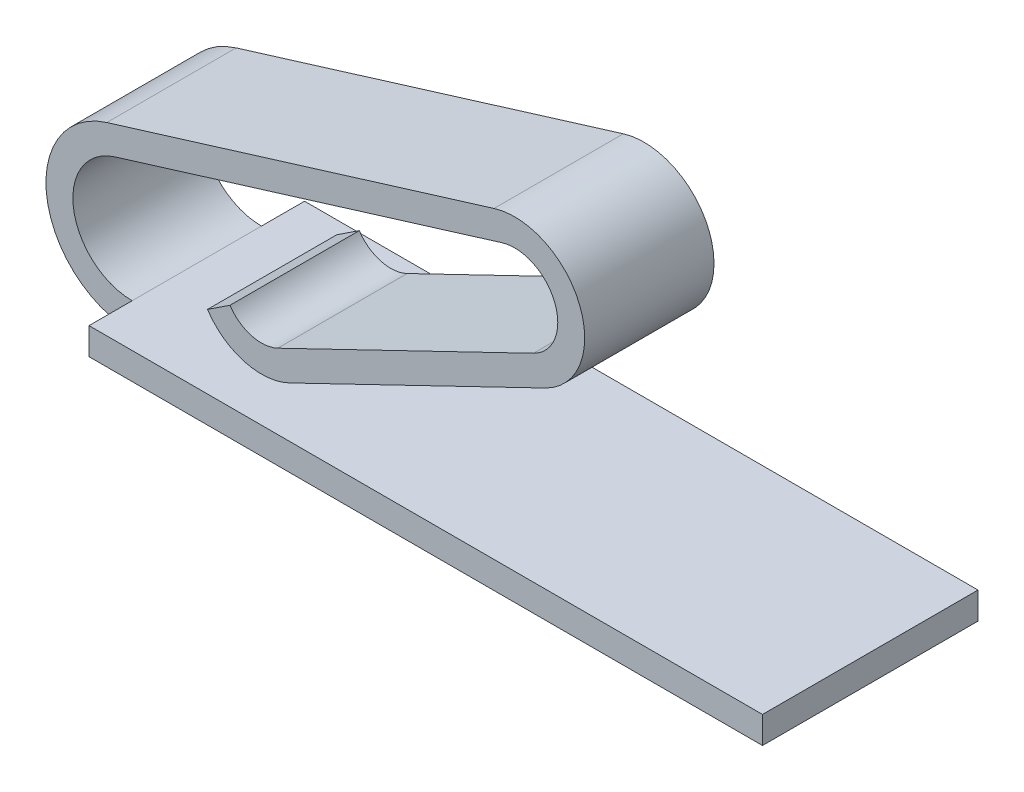
ISO-10303-21;
HEADER;
FILE_DESCRIPTION(('STEP AP214'),'2;1');
FILE_NAME('part.step','',(''),(''),'','','');
FILE_SCHEMA(('AUTOMOTIVE_DESIGN { 1 0 10303 214 1 1 1 1 }'));
ENDSEC;
DATA;
#1=APPLICATION_CONTEXT('core data for automotive mechanical design processes');
#2=APPLICATION_PROTOCOL_DEFINITION('international standard','automotive_design',2000,#1);
#3=PRODUCT_CONTEXT('',#1,'mechanical');
#4=PRODUCT('Part','Part','',(#3));
#5=PRODUCT_RELATED_PRODUCT_CATEGORY('part','',(#4));
#6=PRODUCT_DEFINITION_FORMATION('','',#4);
#7=PRODUCT_DEFINITION_CONTEXT('part definition',#1,'design');
#8=PRODUCT_DEFINITION('design','',#6,#7);
#9=PRODUCT_DEFINITION_SHAPE('','',#8);
#10=(LENGTH_UNIT() NAMED_UNIT(*) SI_UNIT(.MILLI.,.METRE.));
#11=(NAMED_UNIT(*) PLANE_ANGLE_UNIT() SI_UNIT($,.RADIAN.));
#12=(NAMED_UNIT(*) SI_UNIT($,.STERADIAN.) SOLID_ANGLE_UNIT());
#13=UNCERTAINTY_MEASURE_WITH_UNIT(LENGTH_MEASURE(1.E-05),#10,'distance_accuracy_value','');
#14=(GEOMETRIC_REPRESENTATION_CONTEXT(3) GLOBAL_UNCERTAINTY_ASSIGNED_CONTEXT((#13)) GLOBAL_UNIT_ASSIGNED_CONTEXT((#10,
#11,#12)) REPRESENTATION_CONTEXT('',''));
#15=CARTESIAN_POINT('',(0.,0.,0.));
#16=DIRECTION('',(0.,0.,1.));
#17=DIRECTION('',(1.,0.,0.));
#18=AXIS2_PLACEMENT_3D('',#15,#16,#17);
#19=CARTESIAN_POINT('',(-3.125,0.25,-1.));
#20=DIRECTION('',(1.,0.,0.));
#21=DIRECTION('',(0.,0.,-1.));
#22=AXIS2_PLACEMENT_3D('',#19,#20,#21);
#23=PLANE('',#22);
#24=DIRECTION('',(0.,1.,0.));
#25=VECTOR('',#24,1.);
#26=CARTESIAN_POINT('',(-3.125,0.25,0.6));
#27=LINE('',#26,#25);
#28=CARTESIAN_POINT('',(-3.125,0.,0.6));
#29=VERTEX_POINT('',#28);
#30=CARTESIAN_POINT('',(-3.125,0.25,0.6));
#31=VERTEX_POINT('',#30);
#32=EDGE_CURVE('E159',#29,#31,#27,.T.);
#33=ORIENTED_EDGE('',*,*,#32,.F.);
#34=DIRECTION('',(0.,0.,1.));
#35=VECTOR('',#34,1.);
#36=CARTESIAN_POINT('',(-3.125,0.,-1.));
#37=LINE('',#36,#35);
#38=CARTESIAN_POINT('',(-3.125,0.,1.));
#39=VERTEX_POINT('',#38);
#40=EDGE_CURVE('E149',#29,#39,#37,.T.);
#41=ORIENTED_EDGE('',*,*,#40,.T.);
#42=DIRECTION('',(0.,-1.,0.));
#43=VECTOR('',#42,1.);
#44=CARTESIAN_POINT('',(-3.125,0.25,1.));
#45=LINE('',#44,#43);
#46=CARTESIAN_POINT('',(-3.125,0.25,1.));
#47=VERTEX_POINT('',#46);
#48=EDGE_CURVE('E11',#47,#39,#45,.T.);
#49=ORIENTED_EDGE('',*,*,#48,.F.);
#50=DIRECTION('',(0.,0.,1.));
#51=VECTOR('',#50,1.);
#52=CARTESIAN_POINT('',(-3.125,0.25,-1.));
#53=LINE('',#52,#51);
#54=EDGE_CURVE('E49',#31,#47,#53,.T.);
#55=ORIENTED_EDGE('',*,*,#54,.F.);
#56=EDGE_LOOP('',(#33,#41,#49,#55));
#57=FACE_BOUND('',#56,.T.);
#58=ADVANCED_FACE('F34',(#57),#23,.F.);
#59=CARTESIAN_POINT('',(-3.125,0.,-1.));
#60=VERTEX_POINT('',#59);
#61=CARTESIAN_POINT('',(-3.125,0.,-0.6));
#62=VERTEX_POINT('',#61);
#63=EDGE_CURVE('E156',#60,#62,#37,.T.);
#64=ORIENTED_EDGE('',*,*,#63,.T.);
#65=DIRECTION('',(0.,1.,0.));
#66=VECTOR('',#65,1.);
#67=CARTESIAN_POINT('',(-3.125,0.25,-0.6));
#68=LINE('',#67,#66);
#69=CARTESIAN_POINT('',(-3.125,0.25,-0.6));
#70=VERTEX_POINT('',#69);
#71=EDGE_CURVE('E57',#62,#70,#68,.T.);
#72=ORIENTED_EDGE('',*,*,#71,.T.);
#73=CARTESIAN_POINT('',(-3.125,0.25,-1.));
#74=VERTEX_POINT('',#73);
#75=EDGE_CURVE('E186',#74,#70,#53,.T.);
#76=ORIENTED_EDGE('',*,*,#75,.F.);
#77=DIRECTION('',(0.,-1.,0.));
#78=VECTOR('',#77,1.);
#79=CARTESIAN_POINT('',(-3.125,0.25,-1.));
#80=LINE('',#79,#78);
#81=EDGE_CURVE('E193',#74,#60,#80,.T.);
#82=ORIENTED_EDGE('',*,*,#81,.T.);
#83=EDGE_LOOP('',(#64,#72,#76,#82));
#84=FACE_BOUND('',#83,.T.);
#85=ADVANCED_FACE('F36',(#84),#23,.F.);
#86=CARTESIAN_POINT('',(-3.125,0.25,1.));
#87=DIRECTION('',(0.,0.,-1.));
#88=DIRECTION('',(-1.,0.,0.));
#89=AXIS2_PLACEMENT_3D('',#86,#87,#88);
#90=PLANE('',#89);
#91=DIRECTION('',(1.,0.,0.));
#92=VECTOR('',#91,1.);
#93=CARTESIAN_POINT('',(-3.125,0.,1.));
#94=LINE('',#93,#92);
#95=CARTESIAN_POINT('',(3.125,0.,1.));
#96=VERTEX_POINT('',#95);
#97=EDGE_CURVE('E155',#39,#96,#94,.T.);
#98=ORIENTED_EDGE('',*,*,#97,.T.);
#99=DIRECTION('',(0.,-1.,0.));
#100=VECTOR('',#99,1.);
#101=CARTESIAN_POINT('',(3.125,0.25,1.));
#102=LINE('',#101,#100);
#103=CARTESIAN_POINT('',(3.125,0.25,1.));
#104=VERTEX_POINT('',#103);
#105=EDGE_CURVE('E42',#104,#96,#102,.T.);
#106=ORIENTED_EDGE('',*,*,#105,.F.);
#107=DIRECTION('',(1.,0.,0.));
#108=VECTOR('',#107,1.);
#109=CARTESIAN_POINT('',(-3.125,0.25,1.));
#110=LINE('',#109,#108);
#111=EDGE_CURVE('E188',#47,#104,#110,.T.);
#112=ORIENTED_EDGE('',*,*,#111,.F.);
#113=ORIENTED_EDGE('',*,*,#48,.T.);
#114=EDGE_LOOP('',(#98,#106,#112,#113));
#115=FACE_BOUND('',#114,.T.);
#116=ADVANCED_FACE('F346',(#115),#90,.F.);
#117=CARTESIAN_POINT('',(3.125,0.25,-1.));
#118=DIRECTION('',(-1.,0.,0.));
#119=DIRECTION('',(0.,0.,1.));
#120=AXIS2_PLACEMENT_3D('',#117,#118,#119);
#121=PLANE('',#120);
#122=DIRECTION('',(0.,0.,-1.));
#123=VECTOR('',#122,1.);
#124=CARTESIAN_POINT('',(3.125,0.,-1.));
#125=LINE('',#124,#123);
#126=CARTESIAN_POINT('',(3.125,0.,-1.));
#127=VERTEX_POINT('',#126);
#128=EDGE_CURVE('E196',#96,#127,#125,.T.);
#129=ORIENTED_EDGE('',*,*,#128,.T.);
#130=DIRECTION('',(0.,-1.,0.));
#131=VECTOR('',#130,1.);
#132=CARTESIAN_POINT('',(3.125,0.25,-1.));
#133=LINE('',#132,#131);
#134=CARTESIAN_POINT('',(3.125,0.25,-1.));
#135=VERTEX_POINT('',#134);
#136=EDGE_CURVE('E202',#135,#127,#133,.T.);
#137=ORIENTED_EDGE('',*,*,#136,.F.);
#138=DIRECTION('',(0.,0.,-1.));
#139=VECTOR('',#138,1.);
#140=CARTESIAN_POINT('',(3.125,0.25,-1.));
#141=LINE('',#140,#139);
#142=EDGE_CURVE('E190',#104,#135,#141,.T.);
#143=ORIENTED_EDGE('',*,*,#142,.F.);
#144=ORIENTED_EDGE('',*,*,#105,.T.);
#145=EDGE_LOOP('',(#129,#137,#143,#144));
#146=FACE_BOUND('',#145,.T.);
#147=ADVANCED_FACE('F208',(#146),#121,.F.);
#148=CARTESIAN_POINT('',(-3.125,0.25,-1.));
#149=DIRECTION('',(0.,0.,1.));
#150=DIRECTION('',(1.,0.,0.));
#151=AXIS2_PLACEMENT_3D('',#148,#149,#150);
#152=PLANE('',#151);
#153=DIRECTION('',(-1.,0.,0.));
#154=VECTOR('',#153,1.);
#155=CARTESIAN_POINT('',(-3.125,0.,-1.));
#156=LINE('',#155,#154);
#157=EDGE_CURVE('E198',#127,#60,#156,.T.);
#158=ORIENTED_EDGE('',*,*,#157,.T.);
#159=ORIENTED_EDGE('',*,*,#81,.F.);
#160=DIRECTION('',(-1.,0.,0.));
#161=VECTOR('',#160,1.);
#162=CARTESIAN_POINT('',(-3.125,0.25,-1.));
#163=LINE('',#162,#161);
#164=EDGE_CURVE('E192',#135,#74,#163,.T.);
#165=ORIENTED_EDGE('',*,*,#164,.F.);
#166=ORIENTED_EDGE('',*,*,#136,.T.);
#167=EDGE_LOOP('',(#158,#159,#165,#166));
#168=FACE_BOUND('',#167,.T.);
#169=ADVANCED_FACE('F215',(#168),#152,.F.);
#170=CARTESIAN_POINT('',(0.,0.25,0.));
#171=DIRECTION('',(0.,1.,0.));
#172=DIRECTION('',(0.,0.,1.));
#173=AXIS2_PLACEMENT_3D('',#170,#171,#172);
#174=PLANE('',#173);
#175=ORIENTED_EDGE('',*,*,#75,.T.);
#176=DIRECTION('',(0.,0.,-1.));
#177=VECTOR('',#176,1.);
#178=CARTESIAN_POINT('',(-3.125,0.25,0.6));
#179=LINE('',#178,#177);
#180=EDGE_CURVE('E179',#31,#70,#179,.T.);
#181=ORIENTED_EDGE('',*,*,#180,.F.);
#182=ORIENTED_EDGE('',*,*,#54,.T.);
#183=ORIENTED_EDGE('',*,*,#111,.T.);
#184=ORIENTED_EDGE('',*,*,#142,.T.);
#185=ORIENTED_EDGE('',*,*,#164,.T.);
#186=EDGE_LOOP('',(#175,#181,#182,#183,#184,#185));
#187=FACE_BOUND('',#186,.T.);
#188=ADVANCED_FACE('F218',(#187),#174,.T.);
#189=CARTESIAN_POINT('',(0.,0.,0.));
#190=DIRECTION('',(0.,1.,0.));
#191=DIRECTION('',(0.,0.,1.));
#192=AXIS2_PLACEMENT_3D('',#189,#190,#191);
#193=PLANE('',#192);
#194=ORIENTED_EDGE('',*,*,#63,.F.);
#195=ORIENTED_EDGE('',*,*,#157,.F.);
#196=ORIENTED_EDGE('',*,*,#128,.F.);
#197=ORIENTED_EDGE('',*,*,#97,.F.);
#198=ORIENTED_EDGE('',*,*,#40,.F.);
#199=DIRECTION('',(0.,0.,-1.));
#200=VECTOR('',#199,1.);
#201=CARTESIAN_POINT('',(-3.125,0.,0.6));
#202=LINE('',#201,#200);
#203=EDGE_CURVE('E153',#29,#62,#202,.T.);
#204=ORIENTED_EDGE('',*,*,#203,.T.);
#205=EDGE_LOOP('',(#194,#195,#196,#197,#198,#204));
#206=FACE_BOUND('',#205,.T.);
#207=ADVANCED_FACE('F151',(#206),#193,.F.);
#208=CARTESIAN_POINT('',(-3.125,0.8,0.6));
#209=DIRECTION('',(0.,0.,-1.));
#210=DIRECTION('',(-1.,0.,0.));
#211=AXIS2_PLACEMENT_3D('',#208,#209,#210);
#212=CYLINDRICAL_SURFACE('',#211,0.8);
#213=CARTESIAN_POINT('',(-3.125,0.8,-0.6));
#214=DIRECTION('',(0.,0.,1.));
#215=DIRECTION('',(-1.,0.,0.));
#216=AXIS2_PLACEMENT_3D('',#213,#214,#215);
#217=CIRCLE('',#216,0.8);
#218=CARTESIAN_POINT('',(-3.36041486334591,1.56457821190237,-0.6));
#219=VERTEX_POINT('',#218);
#220=EDGE_CURVE('E178',#219,#62,#217,.T.);
#221=ORIENTED_EDGE('',*,*,#220,.T.);
#222=ORIENTED_EDGE('',*,*,#203,.F.);
#223=CARTESIAN_POINT('',(-3.125,0.8,0.6));
#224=DIRECTION('',(0.,0.,1.));
#225=DIRECTION('',(-1.,0.,0.));
#226=AXIS2_PLACEMENT_3D('',#223,#224,#225);
#227=CIRCLE('',#226,0.8);
#228=CARTESIAN_POINT('',(-3.36041486334591,1.56457821190237,0.6));
#229=VERTEX_POINT('',#228);
#230=EDGE_CURVE('E164',#229,#29,#227,.T.);
#231=ORIENTED_EDGE('',*,*,#230,.F.);
#232=DIRECTION('',(0.,0.,-1.));
#233=VECTOR('',#232,1.);
#234=CARTESIAN_POINT('',(-3.36041486334591,1.56457821190237,0.6));
#235=LINE('',#234,#233);
#236=EDGE_CURVE('E250',#229,#219,#235,.T.);
#237=ORIENTED_EDGE('',*,*,#236,.T.);
#238=EDGE_LOOP('',(#221,#222,#231,#237));
#239=FACE_BOUND('',#238,.T.);
#240=ADVANCED_FACE('F176',(#239),#212,.T.);
#241=CARTESIAN_POINT('',(-3.125,0.8,0.6));
#242=DIRECTION('',(0.,0.,-1.));
#243=DIRECTION('',(-1.,0.,0.));
#244=AXIS2_PLACEMENT_3D('',#241,#242,#243);
#245=CYLINDRICAL_SURFACE('',#244,0.55);
#246=CARTESIAN_POINT('',(-3.125,0.8,-0.6));
#247=DIRECTION('',(0.,0.,-1.));
#248=DIRECTION('',(-1.,0.,0.));
#249=AXIS2_PLACEMENT_3D('',#246,#247,#248);
#250=CIRCLE('',#249,0.55);
#251=CARTESIAN_POINT('',(-3.28684771855031,1.32564752068288,-0.6));
#252=VERTEX_POINT('',#251);
#253=EDGE_CURVE('E223',#70,#252,#250,.T.);
#254=ORIENTED_EDGE('',*,*,#253,.T.);
#255=DIRECTION('',(0.,0.,-1.));
#256=VECTOR('',#255,1.);
#257=CARTESIAN_POINT('',(-3.28684771855031,1.32564752068288,0.6));
#258=LINE('',#257,#256);
#259=CARTESIAN_POINT('',(-3.28684771855031,1.32564752068288,0.6));
#260=VERTEX_POINT('',#259);
#261=EDGE_CURVE('E182',#260,#252,#258,.T.);
#262=ORIENTED_EDGE('',*,*,#261,.F.);
#263=CARTESIAN_POINT('',(-3.125,0.8,0.6));
#264=DIRECTION('',(0.,0.,-1.));
#265=DIRECTION('',(-1.,0.,0.));
#266=AXIS2_PLACEMENT_3D('',#263,#264,#265);
#267=CIRCLE('',#266,0.55);
#268=EDGE_CURVE('E163',#31,#260,#267,.T.);
#269=ORIENTED_EDGE('',*,*,#268,.F.);
#270=ORIENTED_EDGE('',*,*,#180,.T.);
#271=EDGE_LOOP('',(#254,#262,#269,#270));
#272=FACE_BOUND('',#271,.T.);
#273=ADVANCED_FACE('F221',(#272),#245,.F.);
#274=CARTESIAN_POINT('',(-3.28684771855031,1.32564752068288,0.6));
#275=DIRECTION('',(-0.294268579182382,0.955722764877965,0.));
#276=DIRECTION('',(-0.955722764877965,-0.294268579182382,0.));
#277=AXIS2_PLACEMENT_3D('',#274,#275,#276);
#278=PLANE('',#277);
#279=DIRECTION('',(0.955722764877965,0.294268579182382,0.));
#280=VECTOR('',#279,1.);
#281=CARTESIAN_POINT('',(-3.28684771855031,1.32564752068288,-0.6));
#282=LINE('',#281,#280);
#283=CARTESIAN_POINT('',(0.307292568327047,2.43228910595119,-0.6));
#284=VERTEX_POINT('',#283);
#285=EDGE_CURVE('E229',#252,#284,#282,.T.);
#286=ORIENTED_EDGE('',*,*,#285,.T.);
#287=DIRECTION('',(0.,0.,-1.));
#288=VECTOR('',#287,1.);
#289=CARTESIAN_POINT('',(0.307292568327047,2.43228910595119,0.6));
#290=LINE('',#289,#288);
#291=CARTESIAN_POINT('',(0.307292568327047,2.43228910595119,0.6));
#292=VERTEX_POINT('',#291);
#293=EDGE_CURVE('E273',#292,#284,#290,.T.);
#294=ORIENTED_EDGE('',*,*,#293,.F.);
#295=DIRECTION('',(0.955722764877965,0.294268579182382,0.));
#296=VECTOR('',#295,1.);
#297=CARTESIAN_POINT('',(-3.28684771855031,1.32564752068288,0.6));
#298=LINE('',#297,#296);
#299=EDGE_CURVE('E279',#260,#292,#298,.T.);
#300=ORIENTED_EDGE('',*,*,#299,.F.);
#301=ORIENTED_EDGE('',*,*,#261,.T.);
#302=EDGE_LOOP('',(#286,#294,#300,#301));
#303=FACE_BOUND('',#302,.T.);
#304=ADVANCED_FACE('F277',(#303),#278,.F.);
#305=CARTESIAN_POINT('',(0.425,2.05,0.6));
#306=DIRECTION('',(0.,0.,-1.));
#307=DIRECTION('',(-1.,0.,0.));
#308=AXIS2_PLACEMENT_3D('',#305,#306,#307);
#309=CYLINDRICAL_SURFACE('',#308,0.4);
#310=CARTESIAN_POINT('',(0.425,2.05,-0.6));
#311=DIRECTION('',(0.,0.,-1.));
#312=DIRECTION('',(-1.,0.,0.));
#313=AXIS2_PLACEMENT_3D('',#310,#311,#312);
#314=CIRCLE('',#313,0.4);
#315=CARTESIAN_POINT('',(0.598899098727263,1.68977909074868,-0.6));
#316=VERTEX_POINT('',#315);
#317=EDGE_CURVE('E231',#284,#316,#314,.T.);
#318=ORIENTED_EDGE('',*,*,#317,.T.);
#319=DIRECTION('',(0.,0.,-1.));
#320=VECTOR('',#319,1.);
#321=CARTESIAN_POINT('',(0.598899098727263,1.68977909074868,0.6));
#322=LINE('',#321,#320);
#323=CARTESIAN_POINT('',(0.598899098727263,1.68977909074868,0.6));
#324=VERTEX_POINT('',#323);
#325=EDGE_CURVE('E270',#324,#316,#322,.T.);
#326=ORIENTED_EDGE('',*,*,#325,.F.);
#327=CARTESIAN_POINT('',(0.425,2.05,0.6));
#328=DIRECTION('',(0.,0.,-1.));
#329=DIRECTION('',(-1.,0.,0.));
#330=AXIS2_PLACEMENT_3D('',#327,#328,#329);
#331=CIRCLE('',#330,0.4);
#332=EDGE_CURVE('E281',#292,#324,#331,.T.);
#333=ORIENTED_EDGE('',*,*,#332,.F.);
#334=ORIENTED_EDGE('',*,*,#293,.T.);
#335=EDGE_LOOP('',(#318,#326,#333,#334));
#336=FACE_BOUND('',#335,.T.);
#337=ADVANCED_FACE('F333',(#336),#309,.F.);
#338=CARTESIAN_POINT('',(0.598899098727262,1.68977909074868,0.6));
#339=DIRECTION('',(0.434747746818157,-0.900552273128293,0.));
#340=DIRECTION('',(0.900552273128293,0.434747746818157,0.));
#341=AXIS2_PLACEMENT_3D('',#338,#339,#340);
#342=PLANE('',#341);
#343=DIRECTION('',(-0.900552273128293,-0.434747746818157,0.));
#344=VECTOR('',#343,1.);
#345=CARTESIAN_POINT('',(0.598899098727262,1.68977909074868,-0.6));
#346=LINE('',#345,#344);
#347=CARTESIAN_POINT('',(-1.77283828861365,0.544806704405097,-0.6));
#348=VERTEX_POINT('',#347);
#349=EDGE_CURVE('E237',#316,#348,#346,.T.);
#350=ORIENTED_EDGE('',*,*,#349,.T.);
#351=DIRECTION('',(0.,0.,-1.));
#352=VECTOR('',#351,1.);
#353=CARTESIAN_POINT('',(-1.77283828861365,0.544806704405097,0.6));
#354=LINE('',#353,#352);
#355=CARTESIAN_POINT('',(-1.77283828861365,0.544806704405097,0.6));
#356=VERTEX_POINT('',#355);
#357=EDGE_CURVE('E267',#356,#348,#354,.T.);
#358=ORIENTED_EDGE('',*,*,#357,.F.);
#359=DIRECTION('',(-0.900552273128293,-0.434747746818157,0.));
#360=VECTOR('',#359,1.);
#361=CARTESIAN_POINT('',(0.598899098727262,1.68977909074868,0.6));
#362=LINE('',#361,#360);
#363=EDGE_CURVE('E283',#324,#356,#362,.T.);
#364=ORIENTED_EDGE('',*,*,#363,.F.);
#365=ORIENTED_EDGE('',*,*,#325,.T.);
#366=EDGE_LOOP('',(#350,#358,#364,#365));
#367=FACE_BOUND('',#366,.T.);
#368=ADVANCED_FACE('F330',(#367),#342,.F.);
#369=CARTESIAN_POINT('',(-1.925,0.86,0.6));
#370=DIRECTION('',(0.,0.,-1.));
#371=DIRECTION('',(-1.,0.,0.));
#372=AXIS2_PLACEMENT_3D('',#369,#370,#371);
#373=CYLINDRICAL_SURFACE('',#372,0.35);
#374=CARTESIAN_POINT('',(-1.925,0.86,-0.6));
#375=DIRECTION('',(0.,0.,-1.));
#376=DIRECTION('',(1.,0.,0.));
#377=AXIS2_PLACEMENT_3D('',#374,#375,#376);
#378=CIRCLE('',#377,0.35);
#379=CARTESIAN_POINT('',(-2.21722584380026,0.667375868035107,-0.6));
#380=VERTEX_POINT('',#379);
#381=EDGE_CURVE('E239',#348,#380,#378,.T.);
#382=ORIENTED_EDGE('',*,*,#381,.T.);
#383=DIRECTION('',(0.,0.,-1.));
#384=VECTOR('',#383,1.);
#385=CARTESIAN_POINT('',(-2.21722584380026,0.667375868035107,0.6));
#386=LINE('',#385,#384);
#387=CARTESIAN_POINT('',(-2.21722584380026,0.667375868035107,0.6));
#388=VERTEX_POINT('',#387);
#389=EDGE_CURVE('E264',#388,#380,#386,.T.);
#390=ORIENTED_EDGE('',*,*,#389,.F.);
#391=CARTESIAN_POINT('',(-1.925,0.86,0.6));
#392=DIRECTION('',(0.,0.,-1.));
#393=DIRECTION('',(1.,0.,0.));
#394=AXIS2_PLACEMENT_3D('',#391,#392,#393);
#395=CIRCLE('',#394,0.35);
#396=EDGE_CURVE('E288',#356,#388,#395,.T.);
#397=ORIENTED_EDGE('',*,*,#396,.F.);
#398=ORIENTED_EDGE('',*,*,#357,.T.);
#399=EDGE_LOOP('',(#382,#390,#397,#398));
#400=FACE_BOUND('',#399,.T.);
#401=ADVANCED_FACE('F325',(#400),#373,.F.);
#402=CARTESIAN_POINT('',(-2.42595858937187,0.529787202345898,0.6));
#403=DIRECTION('',(0.550354662756836,-0.834930982286446,0.));
#404=DIRECTION('',(0.834930982286446,0.550354662756836,0.));
#405=AXIS2_PLACEMENT_3D('',#402,#403,#404);
#406=PLANE('',#405);
#407=DIRECTION('',(-0.834930982286446,-0.550354662756836,0.));
#408=VECTOR('',#407,1.);
#409=CARTESIAN_POINT('',(-2.42595858937187,0.529787202345898,-0.6));
#410=LINE('',#409,#408);
#411=CARTESIAN_POINT('',(-2.42595858937187,0.529787202345898,-0.6));
#412=VERTEX_POINT('',#411);
#413=EDGE_CURVE('E241',#380,#412,#410,.T.);
#414=ORIENTED_EDGE('',*,*,#413,.T.);
#415=DIRECTION('',(0.,0.,-1.));
#416=VECTOR('',#415,1.);
#417=CARTESIAN_POINT('',(-2.42595858937187,0.529787202345898,0.6));
#418=LINE('',#417,#416);
#419=CARTESIAN_POINT('',(-2.42595858937187,0.529787202345898,0.6));
#420=VERTEX_POINT('',#419);
#421=EDGE_CURVE('E261',#420,#412,#418,.T.);
#422=ORIENTED_EDGE('',*,*,#421,.F.);
#423=DIRECTION('',(-0.834930982286446,-0.550354662756836,0.));
#424=VECTOR('',#423,1.);
#425=CARTESIAN_POINT('',(-2.42595858937187,0.529787202345898,0.6));
#426=LINE('',#425,#424);
#427=EDGE_CURVE('E290',#388,#420,#426,.T.);
#428=ORIENTED_EDGE('',*,*,#427,.F.);
#429=ORIENTED_EDGE('',*,*,#389,.T.);
#430=EDGE_LOOP('',(#414,#422,#428,#429));
#431=FACE_BOUND('',#430,.T.);
#432=ADVANCED_FACE('F320',(#431),#406,.F.);
#433=CARTESIAN_POINT('',(-1.925,0.86,0.6));
#434=DIRECTION('',(0.,0.,-1.));
#435=DIRECTION('',(-1.,0.,0.));
#436=AXIS2_PLACEMENT_3D('',#433,#434,#435);
#437=CYLINDRICAL_SURFACE('',#436,0.6);
#438=CARTESIAN_POINT('',(-1.925,0.86,-0.6));
#439=DIRECTION('',(0.,0.,1.));
#440=DIRECTION('',(1.,0.,0.));
#441=AXIS2_PLACEMENT_3D('',#438,#439,#440);
#442=CIRCLE('',#441,0.6);
#443=CARTESIAN_POINT('',(-1.66415135190911,0.319668636123024,-0.6));
#444=VERTEX_POINT('',#443);
#445=EDGE_CURVE('E243',#412,#444,#442,.T.);
#446=ORIENTED_EDGE('',*,*,#445,.T.);
#447=DIRECTION('',(0.,0.,-1.));
#448=VECTOR('',#447,1.);
#449=CARTESIAN_POINT('',(-1.66415135190911,0.319668636123024,0.6));
#450=LINE('',#449,#448);
#451=CARTESIAN_POINT('',(-1.66415135190911,0.319668636123024,0.6));
#452=VERTEX_POINT('',#451);
#453=EDGE_CURVE('E258',#452,#444,#450,.T.);
#454=ORIENTED_EDGE('',*,*,#453,.F.);
#455=CARTESIAN_POINT('',(-1.925,0.86,0.6));
#456=DIRECTION('',(0.,0.,1.));
#457=DIRECTION('',(1.,0.,0.));
#458=AXIS2_PLACEMENT_3D('',#455,#456,#457);
#459=CIRCLE('',#458,0.6);
#460=EDGE_CURVE('E292',#420,#452,#459,.T.);
#461=ORIENTED_EDGE('',*,*,#460,.F.);
#462=ORIENTED_EDGE('',*,*,#421,.T.);
#463=EDGE_LOOP('',(#446,#454,#461,#462));
#464=FACE_BOUND('',#463,.T.);
#465=ADVANCED_FACE('F316',(#464),#437,.T.);
#466=CARTESIAN_POINT('',(0.707586035431801,1.46464102246661,0.6));
#467=DIRECTION('',(-0.434747746818157,0.900552273128293,0.));
#468=DIRECTION('',(-0.900552273128293,-0.434747746818157,0.));
#469=AXIS2_PLACEMENT_3D('',#466,#467,#468);
#470=PLANE('',#469);
#471=DIRECTION('',(0.900552273128293,0.434747746818157,0.));
#472=VECTOR('',#471,1.);
#473=CARTESIAN_POINT('',(0.707586035431801,1.46464102246661,-0.6));
#474=LINE('',#473,#472);
#475=CARTESIAN_POINT('',(0.707586035431801,1.46464102246661,-0.6));
#476=VERTEX_POINT('',#475);
#477=EDGE_CURVE('E245',#444,#476,#474,.T.);
#478=ORIENTED_EDGE('',*,*,#477,.T.);
#479=DIRECTION('',(0.,0.,-1.));
#480=VECTOR('',#479,1.);
#481=CARTESIAN_POINT('',(0.707586035431801,1.46464102246661,0.6));
#482=LINE('',#481,#480);
#483=CARTESIAN_POINT('',(0.707586035431801,1.46464102246661,0.6));
#484=VERTEX_POINT('',#483);
#485=EDGE_CURVE('E255',#484,#476,#482,.T.);
#486=ORIENTED_EDGE('',*,*,#485,.F.);
#487=DIRECTION('',(0.900552273128293,0.434747746818157,0.));
#488=VECTOR('',#487,1.);
#489=CARTESIAN_POINT('',(0.707586035431801,1.46464102246661,0.6));
#490=LINE('',#489,#488);
#491=EDGE_CURVE('E294',#452,#484,#490,.T.);
#492=ORIENTED_EDGE('',*,*,#491,.F.);
#493=ORIENTED_EDGE('',*,*,#453,.T.);
#494=EDGE_LOOP('',(#478,#486,#492,#493));
#495=FACE_BOUND('',#494,.T.);
#496=ADVANCED_FACE('F312',(#495),#470,.F.);
#497=CARTESIAN_POINT('',(0.425,2.05,0.6));
#498=DIRECTION('',(0.,0.,-1.));
#499=DIRECTION('',(-1.,0.,0.));
#500=AXIS2_PLACEMENT_3D('',#497,#498,#499);
#501=CYLINDRICAL_SURFACE('',#500,0.65);
#502=CARTESIAN_POINT('',(0.425,2.05,-0.6));
#503=DIRECTION('',(0.,0.,1.));
#504=DIRECTION('',(-1.,0.,0.));
#505=AXIS2_PLACEMENT_3D('',#502,#503,#504);
#506=CIRCLE('',#505,0.65);
#507=CARTESIAN_POINT('',(0.233725423531452,2.67121979717068,-0.6));
#508=VERTEX_POINT('',#507);
#509=EDGE_CURVE('E247',#476,#508,#506,.T.);
#510=ORIENTED_EDGE('',*,*,#509,.T.);
#511=DIRECTION('',(0.,0.,-1.));
#512=VECTOR('',#511,1.);
#513=CARTESIAN_POINT('',(0.233725423531452,2.67121979717068,0.6));
#514=LINE('',#513,#512);
#515=CARTESIAN_POINT('',(0.233725423531452,2.67121979717068,0.6));
#516=VERTEX_POINT('',#515);
#517=EDGE_CURVE('E252',#516,#508,#514,.T.);
#518=ORIENTED_EDGE('',*,*,#517,.F.);
#519=CARTESIAN_POINT('',(0.425,2.05,0.6));
#520=DIRECTION('',(0.,0.,1.));
#521=DIRECTION('',(-1.,0.,0.));
#522=AXIS2_PLACEMENT_3D('',#519,#520,#521);
#523=CIRCLE('',#522,0.65);
#524=EDGE_CURVE('E296',#484,#516,#523,.T.);
#525=ORIENTED_EDGE('',*,*,#524,.F.);
#526=ORIENTED_EDGE('',*,*,#485,.T.);
#527=EDGE_LOOP('',(#510,#518,#525,#526));
#528=FACE_BOUND('',#527,.T.);
#529=ADVANCED_FACE('F303',(#528),#501,.T.);
#530=CARTESIAN_POINT('',(-3.36041486334591,1.56457821190237,0.6));
#531=DIRECTION('',(0.294268579182382,-0.955722764877965,0.));
#532=DIRECTION('',(0.955722764877965,0.294268579182382,0.));
#533=AXIS2_PLACEMENT_3D('',#530,#531,#532);
#534=PLANE('',#533);
#535=DIRECTION('',(-0.955722764877965,-0.294268579182382,0.));
#536=VECTOR('',#535,1.);
#537=CARTESIAN_POINT('',(-3.36041486334591,1.56457821190237,-0.6));
#538=LINE('',#537,#536);
#539=EDGE_CURVE('E173',#508,#219,#538,.T.);
#540=ORIENTED_EDGE('',*,*,#539,.T.);
#541=ORIENTED_EDGE('',*,*,#236,.F.);
#542=DIRECTION('',(-0.955722764877965,-0.294268579182382,0.));
#543=VECTOR('',#542,1.);
#544=CARTESIAN_POINT('',(-3.36041486334591,1.56457821190237,0.6));
#545=LINE('',#544,#543);
#546=EDGE_CURVE('E169',#516,#229,#545,.T.);
#547=ORIENTED_EDGE('',*,*,#546,.F.);
#548=ORIENTED_EDGE('',*,*,#517,.T.);
#549=EDGE_LOOP('',(#540,#541,#547,#548));
#550=FACE_BOUND('',#549,.T.);
#551=ADVANCED_FACE('F307',(#550),#534,.F.);
#552=CARTESIAN_POINT('',(-3.125,0.8,0.6));
#553=DIRECTION('',(0.,0.,-1.));
#554=DIRECTION('',(-1.,0.,0.));
#555=AXIS2_PLACEMENT_3D('',#552,#553,#554);
#556=PLANE('',#555);
#557=ORIENTED_EDGE('',*,*,#230,.T.);
#558=ORIENTED_EDGE('',*,*,#32,.T.);
#559=ORIENTED_EDGE('',*,*,#268,.T.);
#560=ORIENTED_EDGE('',*,*,#299,.T.);
#561=ORIENTED_EDGE('',*,*,#332,.T.);
#562=ORIENTED_EDGE('',*,*,#363,.T.);
#563=ORIENTED_EDGE('',*,*,#396,.T.);
#564=ORIENTED_EDGE('',*,*,#427,.T.);
#565=ORIENTED_EDGE('',*,*,#460,.T.);
#566=ORIENTED_EDGE('',*,*,#491,.T.);
#567=ORIENTED_EDGE('',*,*,#524,.T.);
#568=ORIENTED_EDGE('',*,*,#546,.T.);
#569=EDGE_LOOP('',(#557,#558,#559,#560,#561,#562,#563,#564,#565,#566,#567,#568));
#570=FACE_BOUND('',#569,.T.);
#571=ADVANCED_FACE('F167',(#570),#556,.F.);
#572=CARTESIAN_POINT('',(-3.125,0.8,-0.6));
#573=DIRECTION('',(0.,0.,-1.));
#574=DIRECTION('',(-1.,0.,0.));
#575=AXIS2_PLACEMENT_3D('',#572,#573,#574);
#576=PLANE('',#575);
#577=ORIENTED_EDGE('',*,*,#220,.F.);
#578=ORIENTED_EDGE('',*,*,#539,.F.);
#579=ORIENTED_EDGE('',*,*,#509,.F.);
#580=ORIENTED_EDGE('',*,*,#477,.F.);
#581=ORIENTED_EDGE('',*,*,#445,.F.);
#582=ORIENTED_EDGE('',*,*,#413,.F.);
#583=ORIENTED_EDGE('',*,*,#381,.F.);
#584=ORIENTED_EDGE('',*,*,#349,.F.);
#585=ORIENTED_EDGE('',*,*,#317,.F.);
#586=ORIENTED_EDGE('',*,*,#285,.F.);
#587=ORIENTED_EDGE('',*,*,#253,.F.);
#588=ORIENTED_EDGE('',*,*,#71,.F.);
#589=EDGE_LOOP('',(#577,#578,#579,#580,#581,#582,#583,#584,#585,#586,#587,#588));
#590=FACE_BOUND('',#589,.T.);
#591=ADVANCED_FACE('F227',(#590),#576,.T.);
#592=CLOSED_SHELL('',(#58,#85,#116,#147,#169,#188,#207,#240,#273,#304,#337,#368,#401,#432,#465,
#496,#529,#551,#571,#591));
#593=MANIFOLD_SOLID_BREP('B2',#592);
#594=ADVANCED_BREP_SHAPE_REPRESENTATION('',(#18,#593),#14);
#595=SHAPE_DEFINITION_REPRESENTATION(#9,#594);
ENDSEC;
END-ISO-10303-21;
